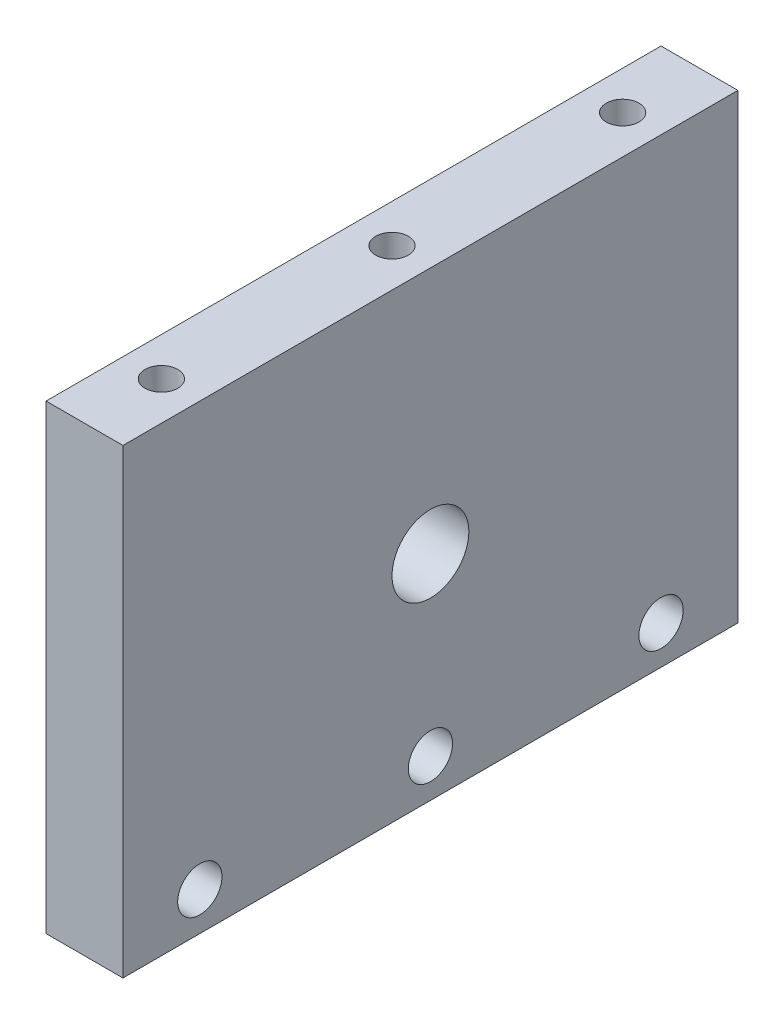
ISO-10303-21;
HEADER;
FILE_DESCRIPTION(('STEP AP214'),'2;1');
FILE_NAME('part.step','',(''),(''),'','','');
FILE_SCHEMA(('AUTOMOTIVE_DESIGN { 1 0 10303 214 1 1 1 1 }'));
ENDSEC;
DATA;
#1=APPLICATION_CONTEXT('core data for automotive mechanical design processes');
#2=APPLICATION_PROTOCOL_DEFINITION('international standard','automotive_design',2000,#1);
#3=PRODUCT_CONTEXT('',#1,'mechanical');
#4=PRODUCT('Part','Part','',(#3));
#5=PRODUCT_RELATED_PRODUCT_CATEGORY('part','',(#4));
#6=PRODUCT_DEFINITION_FORMATION('','',#4);
#7=PRODUCT_DEFINITION_CONTEXT('part definition',#1,'design');
#8=PRODUCT_DEFINITION('design','',#6,#7);
#9=PRODUCT_DEFINITION_SHAPE('','',#8);
#10=(LENGTH_UNIT() NAMED_UNIT(*) SI_UNIT(.MILLI.,.METRE.));
#11=(NAMED_UNIT(*) PLANE_ANGLE_UNIT() SI_UNIT($,.RADIAN.));
#12=(NAMED_UNIT(*) SI_UNIT($,.STERADIAN.) SOLID_ANGLE_UNIT());
#13=UNCERTAINTY_MEASURE_WITH_UNIT(LENGTH_MEASURE(1.E-05),#10,'distance_accuracy_value','');
#14=(GEOMETRIC_REPRESENTATION_CONTEXT(3) GLOBAL_UNCERTAINTY_ASSIGNED_CONTEXT((#13)) GLOBAL_UNIT_ASSIGNED_CONTEXT((#10,
#11,#12)) REPRESENTATION_CONTEXT('',''));
#15=CARTESIAN_POINT('',(0.,0.,0.));
#16=DIRECTION('',(0.,0.,1.));
#17=DIRECTION('',(1.,0.,0.));
#18=AXIS2_PLACEMENT_3D('',#15,#16,#17);
#19=CARTESIAN_POINT('',(6.35,0.,0.));
#20=DIRECTION('',(0.,0.,1.));
#21=DIRECTION('',(1.,0.,0.));
#22=AXIS2_PLACEMENT_3D('',#19,#20,#21);
#23=PLANE('',#22);
#24=DIRECTION('',(0.,1.,0.));
#25=VECTOR('',#24,1.);
#26=CARTESIAN_POINT('',(0.,0.,0.));
#27=LINE('',#26,#25);
#28=CARTESIAN_POINT('',(0.,0.,0.));
#29=VERTEX_POINT('',#28);
#30=CARTESIAN_POINT('',(0.,38.1,0.));
#31=VERTEX_POINT('',#30);
#32=EDGE_CURVE('E143',#29,#31,#27,.T.);
#33=ORIENTED_EDGE('',*,*,#32,.T.);
#34=DIRECTION('',(-1.,0.,0.));
#35=VECTOR('',#34,1.);
#36=CARTESIAN_POINT('',(6.35,38.1,0.));
#37=LINE('',#36,#35);
#38=CARTESIAN_POINT('',(6.35,38.1,0.));
#39=VERTEX_POINT('',#38);
#40=EDGE_CURVE('E11',#39,#31,#37,.T.);
#41=ORIENTED_EDGE('',*,*,#40,.F.);
#42=DIRECTION('',(0.,1.,0.));
#43=VECTOR('',#42,1.);
#44=CARTESIAN_POINT('',(6.35,0.,0.));
#45=LINE('',#44,#43);
#46=CARTESIAN_POINT('',(6.35,0.,0.));
#47=VERTEX_POINT('',#46);
#48=EDGE_CURVE('E163',#47,#39,#45,.T.);
#49=ORIENTED_EDGE('',*,*,#48,.F.);
#50=DIRECTION('',(-1.,0.,0.));
#51=VECTOR('',#50,1.);
#52=CARTESIAN_POINT('',(6.35,0.,0.));
#53=LINE('',#52,#51);
#54=EDGE_CURVE('E173',#47,#29,#53,.T.);
#55=ORIENTED_EDGE('',*,*,#54,.T.);
#56=EDGE_LOOP('',(#33,#41,#49,#55));
#57=FACE_BOUND('',#56,.T.);
#58=ADVANCED_FACE('F45',(#57),#23,.F.);
#59=CARTESIAN_POINT('',(6.35,38.1,0.));
#60=DIRECTION('',(0.,-1.,0.));
#61=DIRECTION('',(0.,0.,-1.));
#62=AXIS2_PLACEMENT_3D('',#59,#60,#61);
#63=PLANE('',#62);
#64=CARTESIAN_POINT('',(3.175,38.1,6.35000000000001));
#65=DIRECTION('',(0.,1.,0.));
#66=DIRECTION('',(0.,0.,1.));
#67=AXIS2_PLACEMENT_3D('',#64,#65,#66);
#68=CIRCLE('',#67,1.35255);
#69=CARTESIAN_POINT('',(3.175,38.1,7.70255000000001));
#70=VERTEX_POINT('',#69);
#71=EDGE_CURVE('E115',#70,#70,#68,.T.);
#72=ORIENTED_EDGE('',*,*,#71,.F.);
#73=EDGE_LOOP('',(#72));
#74=FACE_BOUND('',#73,.T.);
#75=CARTESIAN_POINT('',(3.175,38.1,25.4));
#76=DIRECTION('',(0.,1.,0.));
#77=DIRECTION('',(0.,0.,1.));
#78=AXIS2_PLACEMENT_3D('',#75,#76,#77);
#79=CIRCLE('',#78,1.35255);
#80=CARTESIAN_POINT('',(3.175,38.1,26.75255));
#81=VERTEX_POINT('',#80);
#82=EDGE_CURVE('E114',#81,#81,#79,.T.);
#83=ORIENTED_EDGE('',*,*,#82,.F.);
#84=EDGE_LOOP('',(#83));
#85=FACE_BOUND('',#84,.T.);
#86=CARTESIAN_POINT('',(3.175,38.1,44.45));
#87=DIRECTION('',(0.,1.,0.));
#88=DIRECTION('',(0.,0.,1.));
#89=AXIS2_PLACEMENT_3D('',#86,#87,#88);
#90=CIRCLE('',#89,1.35255);
#91=CARTESIAN_POINT('',(3.175,38.1,45.80255));
#92=VERTEX_POINT('',#91);
#93=EDGE_CURVE('E130',#92,#92,#90,.T.);
#94=ORIENTED_EDGE('',*,*,#93,.F.);
#95=EDGE_LOOP('',(#94));
#96=FACE_BOUND('',#95,.T.);
#97=DIRECTION('',(0.,0.,1.));
#98=VECTOR('',#97,1.);
#99=CARTESIAN_POINT('',(0.,38.1,0.));
#100=LINE('',#99,#98);
#101=CARTESIAN_POINT('',(0.,38.1,50.8));
#102=VERTEX_POINT('',#101);
#103=EDGE_CURVE('E177',#31,#102,#100,.T.);
#104=ORIENTED_EDGE('',*,*,#103,.T.);
#105=DIRECTION('',(-1.,0.,0.));
#106=VECTOR('',#105,1.);
#107=CARTESIAN_POINT('',(6.35,38.1,50.8));
#108=LINE('',#107,#106);
#109=CARTESIAN_POINT('',(6.35,38.1,50.8));
#110=VERTEX_POINT('',#109);
#111=EDGE_CURVE('E54',#110,#102,#108,.T.);
#112=ORIENTED_EDGE('',*,*,#111,.F.);
#113=DIRECTION('',(0.,0.,1.));
#114=VECTOR('',#113,1.);
#115=CARTESIAN_POINT('',(6.35,38.1,0.));
#116=LINE('',#115,#114);
#117=EDGE_CURVE('E93',#39,#110,#116,.T.);
#118=ORIENTED_EDGE('',*,*,#117,.F.);
#119=ORIENTED_EDGE('',*,*,#40,.T.);
#120=EDGE_LOOP('',(#104,#112,#118,#119));
#121=FACE_BOUND('',#120,.T.);
#122=ADVANCED_FACE('F207',(#74,#85,#96,#121),#63,.F.);
#123=CARTESIAN_POINT('',(6.35,0.,50.8));
#124=DIRECTION('',(0.,0.,-1.));
#125=DIRECTION('',(-1.,0.,0.));
#126=AXIS2_PLACEMENT_3D('',#123,#124,#125);
#127=PLANE('',#126);
#128=DIRECTION('',(0.,-1.,0.));
#129=VECTOR('',#128,1.);
#130=CARTESIAN_POINT('',(0.,0.,50.8));
#131=LINE('',#130,#129);
#132=CARTESIAN_POINT('',(0.,0.,50.8));
#133=VERTEX_POINT('',#132);
#134=EDGE_CURVE('E80',#102,#133,#131,.T.);
#135=ORIENTED_EDGE('',*,*,#134,.T.);
#136=DIRECTION('',(-1.,0.,0.));
#137=VECTOR('',#136,1.);
#138=CARTESIAN_POINT('',(6.35,0.,50.8));
#139=LINE('',#138,#137);
#140=CARTESIAN_POINT('',(6.35,0.,50.8));
#141=VERTEX_POINT('',#140);
#142=EDGE_CURVE('E186',#141,#133,#139,.T.);
#143=ORIENTED_EDGE('',*,*,#142,.F.);
#144=DIRECTION('',(0.,-1.,0.));
#145=VECTOR('',#144,1.);
#146=CARTESIAN_POINT('',(6.35,0.,50.8));
#147=LINE('',#146,#145);
#148=EDGE_CURVE('E168',#110,#141,#147,.T.);
#149=ORIENTED_EDGE('',*,*,#148,.F.);
#150=ORIENTED_EDGE('',*,*,#111,.T.);
#151=EDGE_LOOP('',(#135,#143,#149,#150));
#152=FACE_BOUND('',#151,.T.);
#153=ADVANCED_FACE('F190',(#152),#127,.F.);
#154=CARTESIAN_POINT('',(6.35,0.,0.));
#155=DIRECTION('',(0.,1.,0.));
#156=DIRECTION('',(0.,0.,1.));
#157=AXIS2_PLACEMENT_3D('',#154,#155,#156);
#158=PLANE('',#157);
#159=DIRECTION('',(0.,0.,-1.));
#160=VECTOR('',#159,1.);
#161=CARTESIAN_POINT('',(0.,0.,0.));
#162=LINE('',#161,#160);
#163=EDGE_CURVE('E86',#133,#29,#162,.T.);
#164=ORIENTED_EDGE('',*,*,#163,.T.);
#165=ORIENTED_EDGE('',*,*,#54,.F.);
#166=DIRECTION('',(0.,0.,-1.));
#167=VECTOR('',#166,1.);
#168=CARTESIAN_POINT('',(6.35,0.,0.));
#169=LINE('',#168,#167);
#170=EDGE_CURVE('E62',#141,#47,#169,.T.);
#171=ORIENTED_EDGE('',*,*,#170,.F.);
#172=ORIENTED_EDGE('',*,*,#142,.T.);
#173=EDGE_LOOP('',(#164,#165,#171,#172));
#174=FACE_BOUND('',#173,.T.);
#175=ADVANCED_FACE('F197',(#174),#158,.F.);
#176=CARTESIAN_POINT('',(6.35,0.,0.));
#177=DIRECTION('',(1.,0.,0.));
#178=DIRECTION('',(0.,0.,-1.));
#179=AXIS2_PLACEMENT_3D('',#176,#177,#178);
#180=PLANE('',#179);
#181=CARTESIAN_POINT('',(6.35,17.653,25.4));
#182=DIRECTION('',(1.,0.,0.));
#183=DIRECTION('',(0.,0.,-1.));
#184=AXIS2_PLACEMENT_3D('',#181,#182,#183);
#185=CIRCLE('',#184,3.175);
#186=CARTESIAN_POINT('',(6.35,17.653,22.225));
#187=VERTEX_POINT('',#186);
#188=EDGE_CURVE('E274',#187,#187,#185,.T.);
#189=ORIENTED_EDGE('',*,*,#188,.F.);
#190=EDGE_LOOP('',(#189));
#191=FACE_BOUND('',#190,.T.);
#192=CARTESIAN_POINT('',(6.35,3.175,44.45));
#193=DIRECTION('',(1.,0.,0.));
#194=DIRECTION('',(0.,0.,-1.));
#195=AXIS2_PLACEMENT_3D('',#192,#193,#194);
#196=CIRCLE('',#195,1.8288);
#197=CARTESIAN_POINT('',(6.35,3.175,42.6212));
#198=VERTEX_POINT('',#197);
#199=EDGE_CURVE('E144',#198,#198,#196,.T.);
#200=ORIENTED_EDGE('',*,*,#199,.F.);
#201=EDGE_LOOP('',(#200));
#202=FACE_BOUND('',#201,.T.);
#203=CARTESIAN_POINT('',(6.35,3.175,25.4));
#204=DIRECTION('',(1.,0.,0.));
#205=DIRECTION('',(0.,0.,-1.));
#206=AXIS2_PLACEMENT_3D('',#203,#204,#205);
#207=CIRCLE('',#206,1.8288);
#208=CARTESIAN_POINT('',(6.35,3.175,23.5712));
#209=VERTEX_POINT('',#208);
#210=EDGE_CURVE('E152',#209,#209,#207,.T.);
#211=ORIENTED_EDGE('',*,*,#210,.F.);
#212=EDGE_LOOP('',(#211));
#213=FACE_BOUND('',#212,.T.);
#214=CARTESIAN_POINT('',(6.35,3.175,6.35));
#215=DIRECTION('',(1.,0.,0.));
#216=DIRECTION('',(0.,0.,-1.));
#217=AXIS2_PLACEMENT_3D('',#214,#215,#216);
#218=CIRCLE('',#217,1.8288);
#219=CARTESIAN_POINT('',(6.35,3.175,4.5212));
#220=VERTEX_POINT('',#219);
#221=EDGE_CURVE('E138',#220,#220,#218,.T.);
#222=ORIENTED_EDGE('',*,*,#221,.F.);
#223=EDGE_LOOP('',(#222));
#224=FACE_BOUND('',#223,.T.);
#225=ORIENTED_EDGE('',*,*,#48,.T.);
#226=ORIENTED_EDGE('',*,*,#117,.T.);
#227=ORIENTED_EDGE('',*,*,#148,.T.);
#228=ORIENTED_EDGE('',*,*,#170,.T.);
#229=EDGE_LOOP('',(#225,#226,#227,#228));
#230=FACE_BOUND('',#229,.T.);
#231=ADVANCED_FACE('F199',(#191,#202,#213,#224,#230),#180,.T.);
#232=CARTESIAN_POINT('',(0.,0.,0.));
#233=DIRECTION('',(1.,0.,0.));
#234=DIRECTION('',(0.,0.,-1.));
#235=AXIS2_PLACEMENT_3D('',#232,#233,#234);
#236=PLANE('',#235);
#237=CARTESIAN_POINT('',(0.,17.653,25.4));
#238=DIRECTION('',(1.,0.,0.));
#239=DIRECTION('',(0.,0.,-1.));
#240=AXIS2_PLACEMENT_3D('',#237,#238,#239);
#241=CIRCLE('',#240,3.175);
#242=CARTESIAN_POINT('',(0.,17.653,22.225));
#243=VERTEX_POINT('',#242);
#244=EDGE_CURVE('E123',#243,#243,#241,.T.);
#245=ORIENTED_EDGE('',*,*,#244,.T.);
#246=EDGE_LOOP('',(#245));
#247=FACE_BOUND('',#246,.T.);
#248=CARTESIAN_POINT('',(0.,3.175,44.45));
#249=DIRECTION('',(1.,0.,0.));
#250=DIRECTION('',(0.,0.,-1.));
#251=AXIS2_PLACEMENT_3D('',#248,#249,#250);
#252=CIRCLE('',#251,1.8288);
#253=CARTESIAN_POINT('',(0.,3.175,42.6212));
#254=VERTEX_POINT('',#253);
#255=EDGE_CURVE('E139',#254,#254,#252,.T.);
#256=ORIENTED_EDGE('',*,*,#255,.T.);
#257=EDGE_LOOP('',(#256));
#258=FACE_BOUND('',#257,.T.);
#259=CARTESIAN_POINT('',(0.,3.175,25.4));
#260=DIRECTION('',(1.,0.,0.));
#261=DIRECTION('',(0.,0.,-1.));
#262=AXIS2_PLACEMENT_3D('',#259,#260,#261);
#263=CIRCLE('',#262,1.8288);
#264=CARTESIAN_POINT('',(0.,3.175,23.5712));
#265=VERTEX_POINT('',#264);
#266=EDGE_CURVE('E148',#265,#265,#263,.T.);
#267=ORIENTED_EDGE('',*,*,#266,.T.);
#268=EDGE_LOOP('',(#267));
#269=FACE_BOUND('',#268,.T.);
#270=CARTESIAN_POINT('',(0.,3.175,6.35));
#271=DIRECTION('',(1.,0.,0.));
#272=DIRECTION('',(0.,0.,-1.));
#273=AXIS2_PLACEMENT_3D('',#270,#271,#272);
#274=CIRCLE('',#273,1.8288);
#275=CARTESIAN_POINT('',(0.,3.175,4.5212));
#276=VERTEX_POINT('',#275);
#277=EDGE_CURVE('E156',#276,#276,#274,.T.);
#278=ORIENTED_EDGE('',*,*,#277,.T.);
#279=EDGE_LOOP('',(#278));
#280=FACE_BOUND('',#279,.T.);
#281=ORIENTED_EDGE('',*,*,#32,.F.);
#282=ORIENTED_EDGE('',*,*,#163,.F.);
#283=ORIENTED_EDGE('',*,*,#134,.F.);
#284=ORIENTED_EDGE('',*,*,#103,.F.);
#285=EDGE_LOOP('',(#281,#282,#283,#284));
#286=FACE_BOUND('',#285,.T.);
#287=ADVANCED_FACE('F193',(#247,#258,#269,#280,#286),#236,.F.);
#288=CARTESIAN_POINT('',(0.,3.175,6.35));
#289=DIRECTION('',(1.,0.,0.));
#290=DIRECTION('',(0.,0.,-1.));
#291=AXIS2_PLACEMENT_3D('',#288,#289,#290);
#292=CYLINDRICAL_SURFACE('',#291,1.8288);
#293=ORIENTED_EDGE('',*,*,#277,.F.);
#294=EDGE_LOOP('',(#293));
#295=FACE_BOUND('',#294,.T.);
#296=ORIENTED_EDGE('',*,*,#221,.T.);
#297=EDGE_LOOP('',(#296));
#298=FACE_BOUND('',#297,.T.);
#299=ADVANCED_FACE('F247',(#295,#298),#292,.F.);
#300=CARTESIAN_POINT('',(0.,3.175,25.4));
#301=DIRECTION('',(1.,0.,0.));
#302=DIRECTION('',(0.,0.,-1.));
#303=AXIS2_PLACEMENT_3D('',#300,#301,#302);
#304=CYLINDRICAL_SURFACE('',#303,1.8288);
#305=ORIENTED_EDGE('',*,*,#266,.F.);
#306=EDGE_LOOP('',(#305));
#307=FACE_BOUND('',#306,.T.);
#308=ORIENTED_EDGE('',*,*,#210,.T.);
#309=EDGE_LOOP('',(#308));
#310=FACE_BOUND('',#309,.T.);
#311=ADVANCED_FACE('F243',(#307,#310),#304,.F.);
#312=CARTESIAN_POINT('',(0.,3.175,44.45));
#313=DIRECTION('',(1.,0.,0.));
#314=DIRECTION('',(0.,0.,-1.));
#315=AXIS2_PLACEMENT_3D('',#312,#313,#314);
#316=CYLINDRICAL_SURFACE('',#315,1.8288);
#317=ORIENTED_EDGE('',*,*,#255,.F.);
#318=EDGE_LOOP('',(#317));
#319=FACE_BOUND('',#318,.T.);
#320=ORIENTED_EDGE('',*,*,#199,.T.);
#321=EDGE_LOOP('',(#320));
#322=FACE_BOUND('',#321,.T.);
#323=ADVANCED_FACE('F235',(#319,#322),#316,.F.);
#324=CARTESIAN_POINT('',(3.175,26.2126940302657,44.45));
#325=DIRECTION('',(0.,1.,0.));
#326=DIRECTION('',(0.,0.,1.));
#327=AXIS2_PLACEMENT_3D('',#324,#325,#326);
#328=CONICAL_SURFACE('',#327,1.35255,1.02974425867665);
#329=CARTESIAN_POINT('',(3.175,25.4,44.45));
#330=VERTEX_POINT('',#329);
#331=VERTEX_LOOP('',#330);
#332=FACE_BOUND('',#331,.T.);
#333=CARTESIAN_POINT('',(3.175,26.2126940302657,44.45));
#334=DIRECTION('',(0.,1.,0.));
#335=DIRECTION('',(0.,0.,1.));
#336=AXIS2_PLACEMENT_3D('',#333,#334,#335);
#337=CIRCLE('',#336,1.35255);
#338=CARTESIAN_POINT('',(3.175,26.2126940302657,45.80255));
#339=VERTEX_POINT('',#338);
#340=EDGE_CURVE('E134',#339,#339,#337,.T.);
#341=ORIENTED_EDGE('',*,*,#340,.T.);
#342=EDGE_LOOP('',(#341));
#343=FACE_BOUND('',#342,.T.);
#344=ADVANCED_FACE('F226',(#332,#343),#328,.F.);
#345=CARTESIAN_POINT('',(3.175,38.1,44.45));
#346=DIRECTION('',(0.,1.,0.));
#347=DIRECTION('',(0.,0.,1.));
#348=AXIS2_PLACEMENT_3D('',#345,#346,#347);
#349=CYLINDRICAL_SURFACE('',#348,1.35255);
#350=ORIENTED_EDGE('',*,*,#340,.F.);
#351=EDGE_LOOP('',(#350));
#352=FACE_BOUND('',#351,.T.);
#353=ORIENTED_EDGE('',*,*,#93,.T.);
#354=EDGE_LOOP('',(#353));
#355=FACE_BOUND('',#354,.T.);
#356=ADVANCED_FACE('F223',(#352,#355),#349,.F.);
#357=CARTESIAN_POINT('',(3.175,26.2126940302657,25.4));
#358=DIRECTION('',(0.,1.,0.));
#359=DIRECTION('',(0.,0.,1.));
#360=AXIS2_PLACEMENT_3D('',#357,#358,#359);
#361=CONICAL_SURFACE('',#360,1.35255,1.02974425867665);
#362=CARTESIAN_POINT('',(3.175,25.4,25.4));
#363=VERTEX_POINT('',#362);
#364=VERTEX_LOOP('',#363);
#365=FACE_BOUND('',#364,.T.);
#366=CARTESIAN_POINT('',(3.175,26.2126940302657,25.4));
#367=DIRECTION('',(0.,1.,0.));
#368=DIRECTION('',(0.,0.,1.));
#369=AXIS2_PLACEMENT_3D('',#366,#367,#368);
#370=CIRCLE('',#369,1.35255);
#371=CARTESIAN_POINT('',(3.175,26.2126940302657,26.75255));
#372=VERTEX_POINT('',#371);
#373=EDGE_CURVE('E120',#372,#372,#370,.T.);
#374=ORIENTED_EDGE('',*,*,#373,.T.);
#375=EDGE_LOOP('',(#374));
#376=FACE_BOUND('',#375,.T.);
#377=ADVANCED_FACE('F225',(#365,#376),#361,.F.);
#378=CARTESIAN_POINT('',(3.175,38.1,25.4));
#379=DIRECTION('',(0.,1.,0.));
#380=DIRECTION('',(0.,0.,1.));
#381=AXIS2_PLACEMENT_3D('',#378,#379,#380);
#382=CYLINDRICAL_SURFACE('',#381,1.35255);
#383=ORIENTED_EDGE('',*,*,#373,.F.);
#384=EDGE_LOOP('',(#383));
#385=FACE_BOUND('',#384,.T.);
#386=ORIENTED_EDGE('',*,*,#82,.T.);
#387=EDGE_LOOP('',(#386));
#388=FACE_BOUND('',#387,.T.);
#389=ADVANCED_FACE('F107',(#385,#388),#382,.F.);
#390=CARTESIAN_POINT('',(3.175,26.2126940302657,6.35000000000001));
#391=DIRECTION('',(0.,1.,0.));
#392=DIRECTION('',(0.,0.,1.));
#393=AXIS2_PLACEMENT_3D('',#390,#391,#392);
#394=CONICAL_SURFACE('',#393,1.35255,1.02974425867665);
#395=CARTESIAN_POINT('',(3.175,25.4,6.35000000000001));
#396=VERTEX_POINT('',#395);
#397=VERTEX_LOOP('',#396);
#398=FACE_BOUND('',#397,.T.);
#399=CARTESIAN_POINT('',(3.175,26.2126940302657,6.35000000000001));
#400=DIRECTION('',(0.,1.,0.));
#401=DIRECTION('',(0.,0.,1.));
#402=AXIS2_PLACEMENT_3D('',#399,#400,#401);
#403=CIRCLE('',#402,1.35255);
#404=CARTESIAN_POINT('',(3.175,26.2126940302657,7.70255));
#405=VERTEX_POINT('',#404);
#406=EDGE_CURVE('E111',#405,#405,#403,.T.);
#407=ORIENTED_EDGE('',*,*,#406,.T.);
#408=EDGE_LOOP('',(#407));
#409=FACE_BOUND('',#408,.T.);
#410=ADVANCED_FACE('F103',(#398,#409),#394,.F.);
#411=CARTESIAN_POINT('',(3.175,38.1,6.35000000000001));
#412=DIRECTION('',(0.,1.,0.));
#413=DIRECTION('',(0.,0.,1.));
#414=AXIS2_PLACEMENT_3D('',#411,#412,#413);
#415=CYLINDRICAL_SURFACE('',#414,1.35255);
#416=ORIENTED_EDGE('',*,*,#406,.F.);
#417=EDGE_LOOP('',(#416));
#418=FACE_BOUND('',#417,.T.);
#419=ORIENTED_EDGE('',*,*,#71,.T.);
#420=EDGE_LOOP('',(#419));
#421=FACE_BOUND('',#420,.T.);
#422=ADVANCED_FACE('F106',(#418,#421),#415,.F.);
#423=CARTESIAN_POINT('',(0.,17.653,25.4));
#424=DIRECTION('',(1.,0.,0.));
#425=DIRECTION('',(0.,0.,-1.));
#426=AXIS2_PLACEMENT_3D('',#423,#424,#425);
#427=CYLINDRICAL_SURFACE('',#426,3.175);
#428=ORIENTED_EDGE('',*,*,#244,.F.);
#429=EDGE_LOOP('',(#428));
#430=FACE_BOUND('',#429,.T.);
#431=ORIENTED_EDGE('',*,*,#188,.T.);
#432=EDGE_LOOP('',(#431));
#433=FACE_BOUND('',#432,.T.);
#434=ADVANCED_FACE('F280',(#430,#433),#427,.F.);
#435=CLOSED_SHELL('',(#58,#122,#153,#175,#231,#287,#299,#311,#323,#344,#356,#377,#389,#410,#422,#434));
#436=MANIFOLD_SOLID_BREP('B2',#435);
#437=ADVANCED_BREP_SHAPE_REPRESENTATION('',(#18,#436),#14);
#438=SHAPE_DEFINITION_REPRESENTATION(#9,#437);
ENDSEC;
END-ISO-10303-21;
